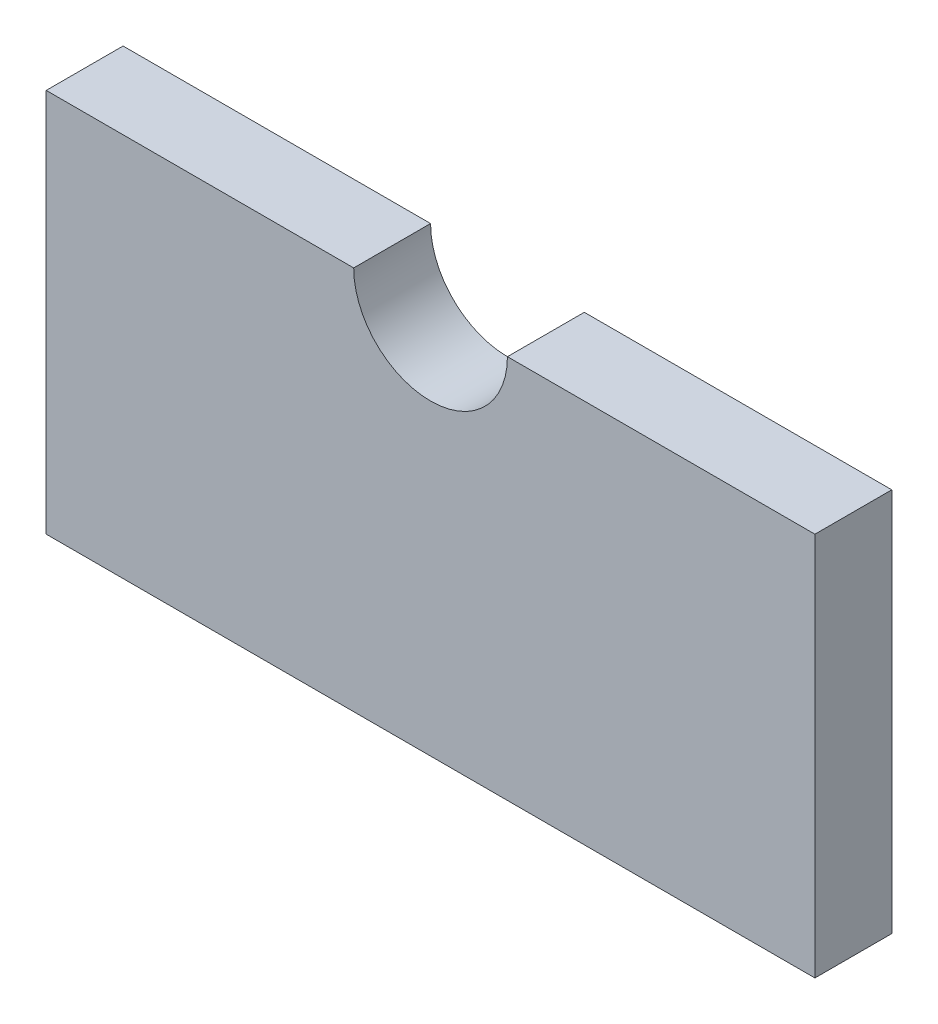
ISO-10303-21;
HEADER;
FILE_DESCRIPTION(('STEP AP214'),'2;1');
FILE_NAME('part.step','',(''),(''),'','','');
FILE_SCHEMA(('AUTOMOTIVE_DESIGN { 1 0 10303 214 1 1 1 1 }'));
ENDSEC;
DATA;
#1=APPLICATION_CONTEXT('core data for automotive mechanical design processes');
#2=APPLICATION_PROTOCOL_DEFINITION('international standard','automotive_design',2000,#1);
#3=PRODUCT_CONTEXT('',#1,'mechanical');
#4=PRODUCT('Part','Part','',(#3));
#5=PRODUCT_RELATED_PRODUCT_CATEGORY('part','',(#4));
#6=PRODUCT_DEFINITION_FORMATION('','',#4);
#7=PRODUCT_DEFINITION_CONTEXT('part definition',#1,'design');
#8=PRODUCT_DEFINITION('design','',#6,#7);
#9=PRODUCT_DEFINITION_SHAPE('','',#8);
#10=(LENGTH_UNIT() NAMED_UNIT(*) SI_UNIT(.MILLI.,.METRE.));
#11=(NAMED_UNIT(*) PLANE_ANGLE_UNIT() SI_UNIT($,.RADIAN.));
#12=(NAMED_UNIT(*) SI_UNIT($,.STERADIAN.) SOLID_ANGLE_UNIT());
#13=UNCERTAINTY_MEASURE_WITH_UNIT(LENGTH_MEASURE(1.E-05),#10,'distance_accuracy_value','');
#14=(GEOMETRIC_REPRESENTATION_CONTEXT(3) GLOBAL_UNCERTAINTY_ASSIGNED_CONTEXT((#13)) GLOBAL_UNIT_ASSIGNED_CONTEXT((#10,
#11,#12)) REPRESENTATION_CONTEXT('',''));
#15=CARTESIAN_POINT('',(0.,0.,0.));
#16=DIRECTION('',(0.,0.,1.));
#17=DIRECTION('',(1.,0.,0.));
#18=AXIS2_PLACEMENT_3D('',#15,#16,#17);
#19=CARTESIAN_POINT('',(-25.,12.5,5.));
#20=DIRECTION('',(0.,1.,0.));
#21=DIRECTION('',(0.,0.,1.));
#22=AXIS2_PLACEMENT_3D('',#19,#20,#21);
#23=PLANE('',#22);
#24=DIRECTION('',(1.,0.,0.));
#25=VECTOR('',#24,1.);
#26=CARTESIAN_POINT('',(-25.,12.5,0.));
#27=LINE('',#26,#25);
#28=CARTESIAN_POINT('',(5.,12.5,0.));
#29=VERTEX_POINT('',#28);
#30=CARTESIAN_POINT('',(25.,12.5,0.));
#31=VERTEX_POINT('',#30);
#32=EDGE_CURVE('E109',#29,#31,#27,.T.);
#33=ORIENTED_EDGE('',*,*,#32,.F.);
#34=DIRECTION('',(0.,0.,-1.));
#35=VECTOR('',#34,1.);
#36=CARTESIAN_POINT('',(5.,12.5,5.));
#37=LINE('',#36,#35);
#38=CARTESIAN_POINT('',(5.,12.5,5.));
#39=VERTEX_POINT('',#38);
#40=EDGE_CURVE('E52',#39,#29,#37,.T.);
#41=ORIENTED_EDGE('',*,*,#40,.F.);
#42=DIRECTION('',(1.,0.,0.));
#43=VECTOR('',#42,1.);
#44=CARTESIAN_POINT('',(-25.,12.5,5.));
#45=LINE('',#44,#43);
#46=CARTESIAN_POINT('',(25.,12.5,5.));
#47=VERTEX_POINT('',#46);
#48=EDGE_CURVE('E107',#39,#47,#45,.T.);
#49=ORIENTED_EDGE('',*,*,#48,.T.);
#50=DIRECTION('',(0.,0.,-1.));
#51=VECTOR('',#50,1.);
#52=CARTESIAN_POINT('',(25.,12.5,5.));
#53=LINE('',#52,#51);
#54=EDGE_CURVE('E45',#47,#31,#53,.T.);
#55=ORIENTED_EDGE('',*,*,#54,.T.);
#56=EDGE_LOOP('',(#33,#41,#49,#55));
#57=FACE_BOUND('',#56,.T.);
#58=ADVANCED_FACE('F37',(#57),#23,.T.);
#59=CARTESIAN_POINT('',(-25.,12.5,5.));
#60=VERTEX_POINT('',#59);
#61=CARTESIAN_POINT('',(-5.,12.5,5.));
#62=VERTEX_POINT('',#61);
#63=EDGE_CURVE('E115',#60,#62,#45,.T.);
#64=ORIENTED_EDGE('',*,*,#63,.T.);
#65=DIRECTION('',(0.,0.,-1.));
#66=VECTOR('',#65,1.);
#67=CARTESIAN_POINT('',(-5.,12.5,5.));
#68=LINE('',#67,#66);
#69=CARTESIAN_POINT('',(-5.,12.5,0.));
#70=VERTEX_POINT('',#69);
#71=EDGE_CURVE('E99',#62,#70,#68,.T.);
#72=ORIENTED_EDGE('',*,*,#71,.T.);
#73=CARTESIAN_POINT('',(-25.,12.5,0.));
#74=VERTEX_POINT('',#73);
#75=EDGE_CURVE('E127',#74,#70,#27,.T.);
#76=ORIENTED_EDGE('',*,*,#75,.F.);
#77=DIRECTION('',(0.,0.,-1.));
#78=VECTOR('',#77,1.);
#79=CARTESIAN_POINT('',(-25.,12.5,5.));
#80=LINE('',#79,#78);
#81=EDGE_CURVE('E132',#60,#74,#80,.T.);
#82=ORIENTED_EDGE('',*,*,#81,.F.);
#83=EDGE_LOOP('',(#64,#72,#76,#82));
#84=FACE_BOUND('',#83,.T.);
#85=ADVANCED_FACE('F143',(#84),#23,.T.);
#86=CARTESIAN_POINT('',(0.,0.,5.));
#87=DIRECTION('',(0.,0.,-1.));
#88=DIRECTION('',(-1.,0.,0.));
#89=AXIS2_PLACEMENT_3D('',#86,#87,#88);
#90=PLANE('',#89);
#91=CARTESIAN_POINT('',(0.,12.5,5.));
#92=DIRECTION('',(0.,0.,1.));
#93=DIRECTION('',(-1.,0.,0.));
#94=AXIS2_PLACEMENT_3D('',#91,#92,#93);
#95=CIRCLE('',#94,5.);
#96=EDGE_CURVE('E96',#62,#39,#95,.T.);
#97=ORIENTED_EDGE('',*,*,#96,.F.);
#98=ORIENTED_EDGE('',*,*,#63,.F.);
#99=DIRECTION('',(0.,-1.,0.));
#100=VECTOR('',#99,1.);
#101=CARTESIAN_POINT('',(-25.,12.5,5.));
#102=LINE('',#101,#100);
#103=CARTESIAN_POINT('',(-25.,-12.5,5.));
#104=VERTEX_POINT('',#103);
#105=EDGE_CURVE('E61',#60,#104,#102,.T.);
#106=ORIENTED_EDGE('',*,*,#105,.T.);
#107=DIRECTION('',(1.,0.,0.));
#108=VECTOR('',#107,1.);
#109=CARTESIAN_POINT('',(-25.,-12.5,5.));
#110=LINE('',#109,#108);
#111=CARTESIAN_POINT('',(25.,-12.5,5.));
#112=VERTEX_POINT('',#111);
#113=EDGE_CURVE('E86',#104,#112,#110,.T.);
#114=ORIENTED_EDGE('',*,*,#113,.T.);
#115=DIRECTION('',(0.,-1.,0.));
#116=VECTOR('',#115,1.);
#117=CARTESIAN_POINT('',(25.,12.5,5.));
#118=LINE('',#117,#116);
#119=EDGE_CURVE('E114',#47,#112,#118,.T.);
#120=ORIENTED_EDGE('',*,*,#119,.F.);
#121=ORIENTED_EDGE('',*,*,#48,.F.);
#122=EDGE_LOOP('',(#97,#98,#106,#114,#120,#121));
#123=FACE_BOUND('',#122,.T.);
#124=ADVANCED_FACE('F112',(#123),#90,.F.);
#125=CARTESIAN_POINT('',(0.,0.,0.));
#126=DIRECTION('',(0.,0.,-1.));
#127=DIRECTION('',(-1.,0.,0.));
#128=AXIS2_PLACEMENT_3D('',#125,#126,#127);
#129=PLANE('',#128);
#130=ORIENTED_EDGE('',*,*,#75,.T.);
#131=CARTESIAN_POINT('',(0.,12.5,0.));
#132=DIRECTION('',(0.,0.,1.));
#133=DIRECTION('',(-1.,0.,0.));
#134=AXIS2_PLACEMENT_3D('',#131,#132,#133);
#135=CIRCLE('',#134,5.);
#136=EDGE_CURVE('E102',#70,#29,#135,.T.);
#137=ORIENTED_EDGE('',*,*,#136,.T.);
#138=ORIENTED_EDGE('',*,*,#32,.T.);
#139=DIRECTION('',(0.,-1.,0.));
#140=VECTOR('',#139,1.);
#141=CARTESIAN_POINT('',(25.,12.5,0.));
#142=LINE('',#141,#140);
#143=CARTESIAN_POINT('',(25.,-12.5,0.));
#144=VERTEX_POINT('',#143);
#145=EDGE_CURVE('E124',#31,#144,#142,.T.);
#146=ORIENTED_EDGE('',*,*,#145,.T.);
#147=DIRECTION('',(1.,0.,0.));
#148=VECTOR('',#147,1.);
#149=CARTESIAN_POINT('',(-25.,-12.5,0.));
#150=LINE('',#149,#148);
#151=CARTESIAN_POINT('',(-25.,-12.5,0.));
#152=VERTEX_POINT('',#151);
#153=EDGE_CURVE('E110',#152,#144,#150,.T.);
#154=ORIENTED_EDGE('',*,*,#153,.F.);
#155=DIRECTION('',(0.,-1.,0.));
#156=VECTOR('',#155,1.);
#157=CARTESIAN_POINT('',(-25.,12.5,0.));
#158=LINE('',#157,#156);
#159=EDGE_CURVE('E81',#74,#152,#158,.T.);
#160=ORIENTED_EDGE('',*,*,#159,.F.);
#161=EDGE_LOOP('',(#130,#137,#138,#146,#154,#160));
#162=FACE_BOUND('',#161,.T.);
#163=ADVANCED_FACE('F138',(#162),#129,.T.);
#164=CARTESIAN_POINT('',(-25.,-12.5,5.));
#165=DIRECTION('',(0.,1.,0.));
#166=DIRECTION('',(0.,0.,1.));
#167=AXIS2_PLACEMENT_3D('',#164,#165,#166);
#168=PLANE('',#167);
#169=ORIENTED_EDGE('',*,*,#153,.T.);
#170=DIRECTION('',(0.,0.,-1.));
#171=VECTOR('',#170,1.);
#172=CARTESIAN_POINT('',(25.,-12.5,5.));
#173=LINE('',#172,#171);
#174=EDGE_CURVE('E11',#112,#144,#173,.T.);
#175=ORIENTED_EDGE('',*,*,#174,.F.);
#176=ORIENTED_EDGE('',*,*,#113,.F.);
#177=DIRECTION('',(0.,0.,-1.));
#178=VECTOR('',#177,1.);
#179=CARTESIAN_POINT('',(-25.,-12.5,5.));
#180=LINE('',#179,#178);
#181=EDGE_CURVE('E121',#104,#152,#180,.T.);
#182=ORIENTED_EDGE('',*,*,#181,.T.);
#183=EDGE_LOOP('',(#169,#175,#176,#182));
#184=FACE_BOUND('',#183,.T.);
#185=ADVANCED_FACE('F39',(#184),#168,.F.);
#186=CARTESIAN_POINT('',(25.,12.5,5.));
#187=DIRECTION('',(1.,0.,0.));
#188=DIRECTION('',(0.,0.,-1.));
#189=AXIS2_PLACEMENT_3D('',#186,#187,#188);
#190=PLANE('',#189);
#191=ORIENTED_EDGE('',*,*,#145,.F.);
#192=ORIENTED_EDGE('',*,*,#54,.F.);
#193=ORIENTED_EDGE('',*,*,#119,.T.);
#194=ORIENTED_EDGE('',*,*,#174,.T.);
#195=EDGE_LOOP('',(#191,#192,#193,#194));
#196=FACE_BOUND('',#195,.T.);
#197=ADVANCED_FACE('F135',(#196),#190,.T.);
#198=CARTESIAN_POINT('',(-25.,12.5,5.));
#199=DIRECTION('',(1.,0.,0.));
#200=DIRECTION('',(0.,0.,-1.));
#201=AXIS2_PLACEMENT_3D('',#198,#199,#200);
#202=PLANE('',#201);
#203=ORIENTED_EDGE('',*,*,#159,.T.);
#204=ORIENTED_EDGE('',*,*,#181,.F.);
#205=ORIENTED_EDGE('',*,*,#105,.F.);
#206=ORIENTED_EDGE('',*,*,#81,.T.);
#207=EDGE_LOOP('',(#203,#204,#205,#206));
#208=FACE_BOUND('',#207,.T.);
#209=ADVANCED_FACE('F144',(#208),#202,.F.);
#210=CARTESIAN_POINT('',(0.,12.5,5.));
#211=DIRECTION('',(0.,0.,-1.));
#212=DIRECTION('',(-1.,0.,0.));
#213=AXIS2_PLACEMENT_3D('',#210,#211,#212);
#214=CYLINDRICAL_SURFACE('',#213,5.);
#215=ORIENTED_EDGE('',*,*,#136,.F.);
#216=ORIENTED_EDGE('',*,*,#71,.F.);
#217=ORIENTED_EDGE('',*,*,#96,.T.);
#218=ORIENTED_EDGE('',*,*,#40,.T.);
#219=EDGE_LOOP('',(#215,#216,#217,#218));
#220=FACE_BOUND('',#219,.T.);
#221=ADVANCED_FACE('F97',(#220),#214,.F.);
#222=CLOSED_SHELL('',(#58,#85,#124,#163,#185,#197,#209,#221));
#223=MANIFOLD_SOLID_BREP('B2',#222);
#224=ADVANCED_BREP_SHAPE_REPRESENTATION('',(#18,#223),#14);
#225=SHAPE_DEFINITION_REPRESENTATION(#9,#224);
ENDSEC;
END-ISO-10303-21;
